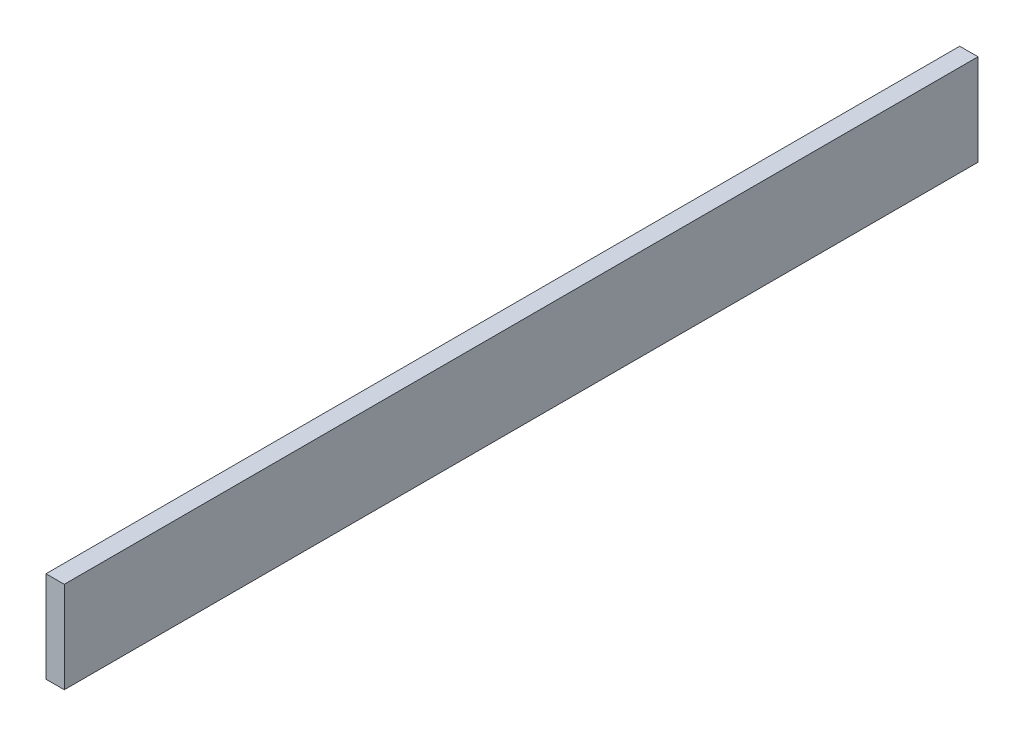
ISO-10303-21;
HEADER;
FILE_DESCRIPTION(('STEP AP214'),'2;1');
FILE_NAME('part.step','',(''),(''),'','','');
FILE_SCHEMA(('AUTOMOTIVE_DESIGN { 1 0 10303 214 1 1 1 1 }'));
ENDSEC;
DATA;
#1=APPLICATION_CONTEXT('core data for automotive mechanical design processes');
#2=APPLICATION_PROTOCOL_DEFINITION('international standard','automotive_design',2000,#1);
#3=PRODUCT_CONTEXT('',#1,'mechanical');
#4=PRODUCT('Part','Part','',(#3));
#5=PRODUCT_RELATED_PRODUCT_CATEGORY('part','',(#4));
#6=PRODUCT_DEFINITION_FORMATION('','',#4);
#7=PRODUCT_DEFINITION_CONTEXT('part definition',#1,'design');
#8=PRODUCT_DEFINITION('design','',#6,#7);
#9=PRODUCT_DEFINITION_SHAPE('','',#8);
#10=(LENGTH_UNIT() NAMED_UNIT(*) SI_UNIT(.MILLI.,.METRE.));
#11=(NAMED_UNIT(*) PLANE_ANGLE_UNIT() SI_UNIT($,.RADIAN.));
#12=(NAMED_UNIT(*) SI_UNIT($,.STERADIAN.) SOLID_ANGLE_UNIT());
#13=UNCERTAINTY_MEASURE_WITH_UNIT(LENGTH_MEASURE(1.E-05),#10,'distance_accuracy_value','');
#14=(GEOMETRIC_REPRESENTATION_CONTEXT(3) GLOBAL_UNCERTAINTY_ASSIGNED_CONTEXT((#13)) GLOBAL_UNIT_ASSIGNED_CONTEXT((#10,
#11,#12)) REPRESENTATION_CONTEXT('',''));
#15=CARTESIAN_POINT('',(0.,0.,0.));
#16=DIRECTION('',(0.,0.,1.));
#17=DIRECTION('',(1.,0.,0.));
#18=AXIS2_PLACEMENT_3D('',#15,#16,#17);
#19=CARTESIAN_POINT('',(-10.,-50.,1000.));
#20=DIRECTION('',(-1.,0.,0.));
#21=DIRECTION('',(0.,0.,1.));
#22=AXIS2_PLACEMENT_3D('',#19,#20,#21);
#23=PLANE('',#22);
#24=DIRECTION('',(0.,1.,0.));
#25=VECTOR('',#24,1.);
#26=CARTESIAN_POINT('',(-10.,-50.,0.));
#27=LINE('',#26,#25);
#28=CARTESIAN_POINT('',(-10.,-50.,0.));
#29=VERTEX_POINT('',#28);
#30=CARTESIAN_POINT('',(-10.,50.,0.));
#31=VERTEX_POINT('',#30);
#32=EDGE_CURVE('E98',#29,#31,#27,.T.);
#33=ORIENTED_EDGE('',*,*,#32,.F.);
#34=DIRECTION('',(0.,0.,-1.));
#35=VECTOR('',#34,1.);
#36=CARTESIAN_POINT('',(-10.,-50.,1000.));
#37=LINE('',#36,#35);
#38=CARTESIAN_POINT('',(-10.,-50.,1000.));
#39=VERTEX_POINT('',#38);
#40=EDGE_CURVE('E11',#39,#29,#37,.T.);
#41=ORIENTED_EDGE('',*,*,#40,.F.);
#42=DIRECTION('',(0.,1.,0.));
#43=VECTOR('',#42,1.);
#44=CARTESIAN_POINT('',(-10.,-50.,1000.));
#45=LINE('',#44,#43);
#46=CARTESIAN_POINT('',(-10.,50.,1000.));
#47=VERTEX_POINT('',#46);
#48=EDGE_CURVE('E93',#39,#47,#45,.T.);
#49=ORIENTED_EDGE('',*,*,#48,.T.);
#50=DIRECTION('',(0.,0.,-1.));
#51=VECTOR('',#50,1.);
#52=CARTESIAN_POINT('',(-10.,50.,1000.));
#53=LINE('',#52,#51);
#54=EDGE_CURVE('E36',#47,#31,#53,.T.);
#55=ORIENTED_EDGE('',*,*,#54,.T.);
#56=EDGE_LOOP('',(#33,#41,#49,#55));
#57=FACE_BOUND('',#56,.T.);
#58=ADVANCED_FACE('F33',(#57),#23,.T.);
#59=CARTESIAN_POINT('',(-10.,-50.,1000.));
#60=DIRECTION('',(0.,1.,0.));
#61=DIRECTION('',(0.,0.,1.));
#62=AXIS2_PLACEMENT_3D('',#59,#60,#61);
#63=PLANE('',#62);
#64=DIRECTION('',(1.,0.,0.));
#65=VECTOR('',#64,1.);
#66=CARTESIAN_POINT('',(-10.,-50.,0.));
#67=LINE('',#66,#65);
#68=CARTESIAN_POINT('',(10.,-50.,0.));
#69=VERTEX_POINT('',#68);
#70=EDGE_CURVE('E66',#29,#69,#67,.T.);
#71=ORIENTED_EDGE('',*,*,#70,.T.);
#72=DIRECTION('',(0.,0.,-1.));
#73=VECTOR('',#72,1.);
#74=CARTESIAN_POINT('',(10.,-50.,1000.));
#75=LINE('',#74,#73);
#76=CARTESIAN_POINT('',(10.,-50.,1000.));
#77=VERTEX_POINT('',#76);
#78=EDGE_CURVE('E42',#77,#69,#75,.T.);
#79=ORIENTED_EDGE('',*,*,#78,.F.);
#80=DIRECTION('',(1.,0.,0.));
#81=VECTOR('',#80,1.);
#82=CARTESIAN_POINT('',(-10.,-50.,1000.));
#83=LINE('',#82,#81);
#84=EDGE_CURVE('E83',#39,#77,#83,.T.);
#85=ORIENTED_EDGE('',*,*,#84,.F.);
#86=ORIENTED_EDGE('',*,*,#40,.T.);
#87=EDGE_LOOP('',(#71,#79,#85,#86));
#88=FACE_BOUND('',#87,.T.);
#89=ADVANCED_FACE('F108',(#88),#63,.F.);
#90=CARTESIAN_POINT('',(10.,-50.,1000.));
#91=DIRECTION('',(-1.,0.,0.));
#92=DIRECTION('',(0.,0.,1.));
#93=AXIS2_PLACEMENT_3D('',#90,#91,#92);
#94=PLANE('',#93);
#95=DIRECTION('',(0.,1.,0.));
#96=VECTOR('',#95,1.);
#97=CARTESIAN_POINT('',(10.,-50.,0.));
#98=LINE('',#97,#96);
#99=CARTESIAN_POINT('',(10.,50.,0.));
#100=VERTEX_POINT('',#99);
#101=EDGE_CURVE('E90',#69,#100,#98,.T.);
#102=ORIENTED_EDGE('',*,*,#101,.T.);
#103=DIRECTION('',(0.,0.,-1.));
#104=VECTOR('',#103,1.);
#105=CARTESIAN_POINT('',(10.,50.,1000.));
#106=LINE('',#105,#104);
#107=CARTESIAN_POINT('',(10.,50.,1000.));
#108=VERTEX_POINT('',#107);
#109=EDGE_CURVE('E87',#108,#100,#106,.T.);
#110=ORIENTED_EDGE('',*,*,#109,.F.);
#111=DIRECTION('',(0.,1.,0.));
#112=VECTOR('',#111,1.);
#113=CARTESIAN_POINT('',(10.,-50.,1000.));
#114=LINE('',#113,#112);
#115=EDGE_CURVE('E78',#77,#108,#114,.T.);
#116=ORIENTED_EDGE('',*,*,#115,.F.);
#117=ORIENTED_EDGE('',*,*,#78,.T.);
#118=EDGE_LOOP('',(#102,#110,#116,#117));
#119=FACE_BOUND('',#118,.T.);
#120=ADVANCED_FACE('F88',(#119),#94,.F.);
#121=CARTESIAN_POINT('',(-10.,50.,1000.));
#122=DIRECTION('',(0.,1.,0.));
#123=DIRECTION('',(0.,0.,1.));
#124=AXIS2_PLACEMENT_3D('',#121,#122,#123);
#125=PLANE('',#124);
#126=DIRECTION('',(1.,0.,0.));
#127=VECTOR('',#126,1.);
#128=CARTESIAN_POINT('',(-10.,50.,0.));
#129=LINE('',#128,#127);
#130=EDGE_CURVE('E101',#31,#100,#129,.T.);
#131=ORIENTED_EDGE('',*,*,#130,.F.);
#132=ORIENTED_EDGE('',*,*,#54,.F.);
#133=DIRECTION('',(1.,0.,0.));
#134=VECTOR('',#133,1.);
#135=CARTESIAN_POINT('',(-10.,50.,1000.));
#136=LINE('',#135,#134);
#137=EDGE_CURVE('E82',#47,#108,#136,.T.);
#138=ORIENTED_EDGE('',*,*,#137,.T.);
#139=ORIENTED_EDGE('',*,*,#109,.T.);
#140=EDGE_LOOP('',(#131,#132,#138,#139));
#141=FACE_BOUND('',#140,.T.);
#142=ADVANCED_FACE('F92',(#141),#125,.T.);
#143=CARTESIAN_POINT('',(0.,0.,1000.));
#144=DIRECTION('',(0.,0.,-1.));
#145=DIRECTION('',(-1.,0.,0.));
#146=AXIS2_PLACEMENT_3D('',#143,#144,#145);
#147=PLANE('',#146);
#148=ORIENTED_EDGE('',*,*,#48,.F.);
#149=ORIENTED_EDGE('',*,*,#84,.T.);
#150=ORIENTED_EDGE('',*,*,#115,.T.);
#151=ORIENTED_EDGE('',*,*,#137,.F.);
#152=EDGE_LOOP('',(#148,#149,#150,#151));
#153=FACE_BOUND('',#152,.T.);
#154=ADVANCED_FACE('F81',(#153),#147,.F.);
#155=CARTESIAN_POINT('',(0.,0.,0.));
#156=DIRECTION('',(0.,0.,-1.));
#157=DIRECTION('',(-1.,0.,0.));
#158=AXIS2_PLACEMENT_3D('',#155,#156,#157);
#159=PLANE('',#158);
#160=ORIENTED_EDGE('',*,*,#32,.T.);
#161=ORIENTED_EDGE('',*,*,#130,.T.);
#162=ORIENTED_EDGE('',*,*,#101,.F.);
#163=ORIENTED_EDGE('',*,*,#70,.F.);
#164=EDGE_LOOP('',(#160,#161,#162,#163));
#165=FACE_BOUND('',#164,.T.);
#166=ADVANCED_FACE('F106',(#165),#159,.T.);
#167=CLOSED_SHELL('',(#58,#89,#120,#142,#154,#166));
#168=MANIFOLD_SOLID_BREP('B2',#167);
#169=ADVANCED_BREP_SHAPE_REPRESENTATION('',(#18,#168),#14);
#170=SHAPE_DEFINITION_REPRESENTATION(#9,#169);
ENDSEC;
END-ISO-10303-21;
